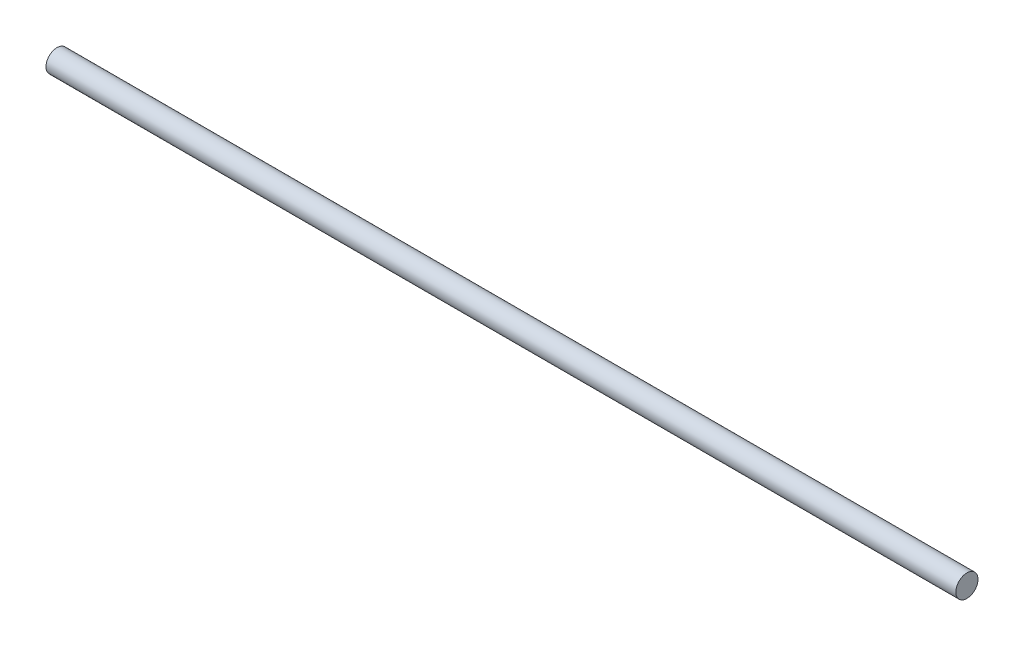
ISO-10303-21;
HEADER;
FILE_DESCRIPTION(('STEP AP214'),'2;1');
FILE_NAME('part.step','',(''),(''),'','','');
FILE_SCHEMA(('AUTOMOTIVE_DESIGN { 1 0 10303 214 1 1 1 1 }'));
ENDSEC;
DATA;
#1=APPLICATION_CONTEXT('core data for automotive mechanical design processes');
#2=APPLICATION_PROTOCOL_DEFINITION('international standard','automotive_design',2000,#1);
#3=PRODUCT_CONTEXT('',#1,'mechanical');
#4=PRODUCT('Part','Part','',(#3));
#5=PRODUCT_RELATED_PRODUCT_CATEGORY('part','',(#4));
#6=PRODUCT_DEFINITION_FORMATION('','',#4);
#7=PRODUCT_DEFINITION_CONTEXT('part definition',#1,'design');
#8=PRODUCT_DEFINITION('design','',#6,#7);
#9=PRODUCT_DEFINITION_SHAPE('','',#8);
#10=(LENGTH_UNIT() NAMED_UNIT(*) SI_UNIT(.MILLI.,.METRE.));
#11=(NAMED_UNIT(*) PLANE_ANGLE_UNIT() SI_UNIT($,.RADIAN.));
#12=(NAMED_UNIT(*) SI_UNIT($,.STERADIAN.) SOLID_ANGLE_UNIT());
#13=UNCERTAINTY_MEASURE_WITH_UNIT(LENGTH_MEASURE(1.E-05),#10,'distance_accuracy_value','');
#14=(GEOMETRIC_REPRESENTATION_CONTEXT(3) GLOBAL_UNCERTAINTY_ASSIGNED_CONTEXT((#13)) GLOBAL_UNIT_ASSIGNED_CONTEXT((#10,
#11,#12)) REPRESENTATION_CONTEXT('',''));
#15=CARTESIAN_POINT('',(0.,0.,0.));
#16=DIRECTION('',(0.,0.,1.));
#17=DIRECTION('',(1.,0.,0.));
#18=AXIS2_PLACEMENT_3D('',#15,#16,#17);
#19=CARTESIAN_POINT('',(80.,0.,0.));
#20=DIRECTION('',(-1.,0.,0.));
#21=DIRECTION('',(0.,0.,1.));
#22=AXIS2_PLACEMENT_3D('',#19,#20,#21);
#23=CYLINDRICAL_SURFACE('',#22,0.975);
#24=CARTESIAN_POINT('',(80.,0.,0.));
#25=DIRECTION('',(1.,0.,0.));
#26=DIRECTION('',(0.,0.,-1.));
#27=AXIS2_PLACEMENT_3D('',#24,#25,#26);
#28=CIRCLE('',#27,0.975);
#29=CARTESIAN_POINT('',(80.,0.,-0.975));
#30=VERTEX_POINT('',#29);
#31=EDGE_CURVE('E10',#30,#30,#28,.T.);
#32=ORIENTED_EDGE('',*,*,#31,.F.);
#33=EDGE_LOOP('',(#32));
#34=FACE_BOUND('',#33,.T.);
#35=CARTESIAN_POINT('',(0.,0.,0.));
#36=DIRECTION('',(1.,0.,0.));
#37=DIRECTION('',(0.,0.,-1.));
#38=AXIS2_PLACEMENT_3D('',#35,#36,#37);
#39=CIRCLE('',#38,0.975);
#40=CARTESIAN_POINT('',(0.,0.,-0.975));
#41=VERTEX_POINT('',#40);
#42=EDGE_CURVE('E34',#41,#41,#39,.T.);
#43=ORIENTED_EDGE('',*,*,#42,.T.);
#44=EDGE_LOOP('',(#43));
#45=FACE_BOUND('',#44,.T.);
#46=ADVANCED_FACE('F31',(#34,#45),#23,.T.);
#47=CARTESIAN_POINT('',(80.,0.,0.));
#48=DIRECTION('',(1.,0.,0.));
#49=DIRECTION('',(0.,0.,-1.));
#50=AXIS2_PLACEMENT_3D('',#47,#48,#49);
#51=PLANE('',#50);
#52=ORIENTED_EDGE('',*,*,#31,.T.);
#53=EDGE_LOOP('',(#52));
#54=FACE_BOUND('',#53,.T.);
#55=ADVANCED_FACE('F46',(#54),#51,.T.);
#56=CARTESIAN_POINT('',(0.,0.,0.));
#57=DIRECTION('',(1.,0.,0.));
#58=DIRECTION('',(0.,0.,-1.));
#59=AXIS2_PLACEMENT_3D('',#56,#57,#58);
#60=PLANE('',#59);
#61=ORIENTED_EDGE('',*,*,#42,.F.);
#62=EDGE_LOOP('',(#61));
#63=FACE_BOUND('',#62,.T.);
#64=ADVANCED_FACE('F44',(#63),#60,.F.);
#65=CLOSED_SHELL('',(#46,#55,#64));
#66=MANIFOLD_SOLID_BREP('B2',#65);
#67=ADVANCED_BREP_SHAPE_REPRESENTATION('',(#18,#66),#14);
#68=SHAPE_DEFINITION_REPRESENTATION(#9,#67);
ENDSEC;
END-ISO-10303-21;
